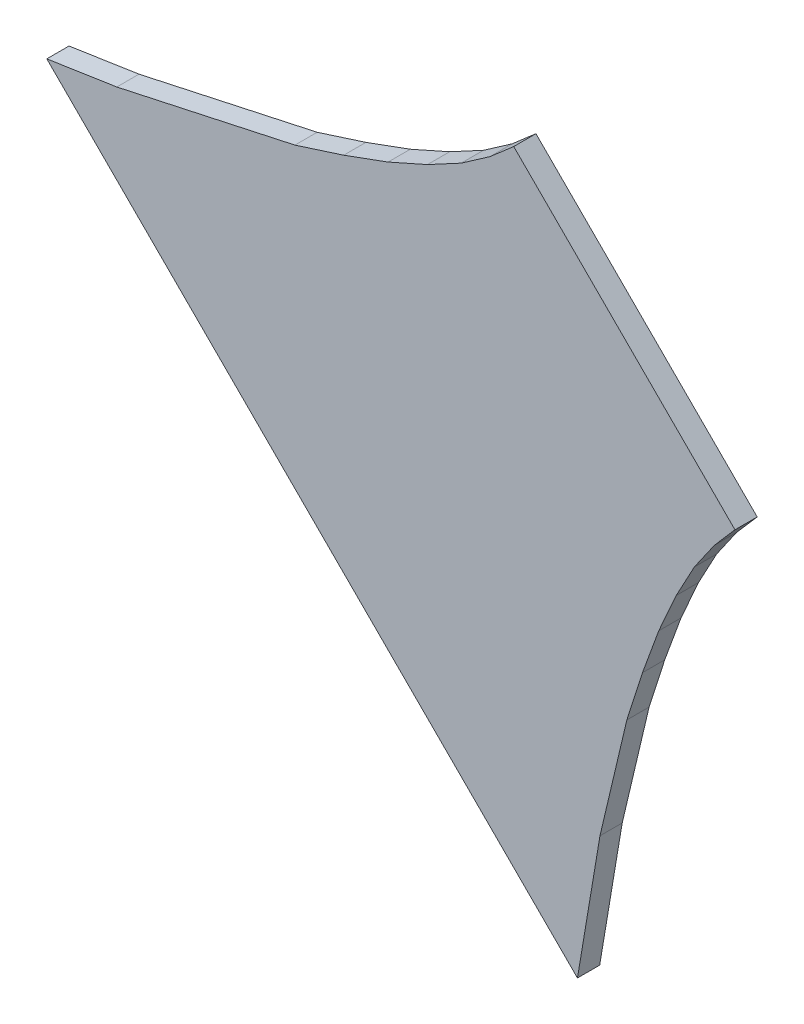
ISO-10303-21;
HEADER;
FILE_DESCRIPTION(('STEP AP214'),'2;1');
FILE_NAME('part.step','',(''),(''),'','','');
FILE_SCHEMA(('AUTOMOTIVE_DESIGN { 1 0 10303 214 1 1 1 1 }'));
ENDSEC;
DATA;
#1=APPLICATION_CONTEXT('core data for automotive mechanical design processes');
#2=APPLICATION_PROTOCOL_DEFINITION('international standard','automotive_design',2000,#1);
#3=PRODUCT_CONTEXT('',#1,'mechanical');
#4=PRODUCT('Part','Part','',(#3));
#5=PRODUCT_RELATED_PRODUCT_CATEGORY('part','',(#4));
#6=PRODUCT_DEFINITION_FORMATION('','',#4);
#7=PRODUCT_DEFINITION_CONTEXT('part definition',#1,'design');
#8=PRODUCT_DEFINITION('design','',#6,#7);
#9=PRODUCT_DEFINITION_SHAPE('','',#8);
#10=(LENGTH_UNIT() NAMED_UNIT(*) SI_UNIT(.MILLI.,.METRE.));
#11=(NAMED_UNIT(*) PLANE_ANGLE_UNIT() SI_UNIT($,.RADIAN.));
#12=(NAMED_UNIT(*) SI_UNIT($,.STERADIAN.) SOLID_ANGLE_UNIT());
#13=UNCERTAINTY_MEASURE_WITH_UNIT(LENGTH_MEASURE(1.E-05),#10,'distance_accuracy_value','');
#14=(GEOMETRIC_REPRESENTATION_CONTEXT(3) GLOBAL_UNCERTAINTY_ASSIGNED_CONTEXT((#13)) GLOBAL_UNIT_ASSIGNED_CONTEXT((#10,
#11,#12)) REPRESENTATION_CONTEXT('',''));
#15=CARTESIAN_POINT('',(0.,0.,0.));
#16=DIRECTION('',(0.,0.,1.));
#17=DIRECTION('',(1.,0.,0.));
#18=AXIS2_PLACEMENT_3D('',#15,#16,#17);
#19=CARTESIAN_POINT('',(48.7519989013672,97.7030029296875,0.));
#20=DIRECTION('',(0.655758286005358,-0.754970906946298,0.));
#21=DIRECTION('',(-0.754970906946298,-0.655758286005358,0.));
#22=AXIS2_PLACEMENT_3D('',#19,#20,#21);
#23=PLANE('',#22);
#24=DIRECTION('',(-0.754970906946298,-0.655758286005358,0.));
#25=VECTOR('',#24,1.);
#26=CARTESIAN_POINT('',(48.7519989013672,97.7030029296875,0.03556));
#27=LINE('',#26,#25);
#28=CARTESIAN_POINT('',(48.7519989013672,97.7030029296875,0.03556));
#29=VERTEX_POINT('',#28);
#30=CARTESIAN_POINT('',(48.7140007019043,97.6699981689453,0.03556));
#31=VERTEX_POINT('',#30);
#32=EDGE_CURVE('E11',#29,#31,#27,.T.);
#33=ORIENTED_EDGE('',*,*,#32,.F.);
#34=DIRECTION('',(0.,0.,1.));
#35=VECTOR('',#34,1.);
#36=CARTESIAN_POINT('',(48.7519989013672,97.7030029296875,0.));
#37=LINE('',#36,#35);
#38=CARTESIAN_POINT('',(48.7519989013672,97.7030029296875,0.));
#39=VERTEX_POINT('',#38);
#40=EDGE_CURVE('E24',#39,#29,#37,.T.);
#41=ORIENTED_EDGE('',*,*,#40,.F.);
#42=DIRECTION('',(-0.754970906946298,-0.655758286005358,0.));
#43=VECTOR('',#42,1.);
#44=CARTESIAN_POINT('',(48.7519989013672,97.7030029296875,0.));
#45=LINE('',#44,#43);
#46=CARTESIAN_POINT('',(48.7140007019043,97.6699981689453,0.));
#47=VERTEX_POINT('',#46);
#48=EDGE_CURVE('E160',#39,#47,#45,.T.);
#49=ORIENTED_EDGE('',*,*,#48,.T.);
#50=DIRECTION('',(0.,0.,1.));
#51=VECTOR('',#50,1.);
#52=CARTESIAN_POINT('',(48.7140007019043,97.6699981689453,0.));
#53=LINE('',#52,#51);
#54=EDGE_CURVE('E37',#47,#31,#53,.T.);
#55=ORIENTED_EDGE('',*,*,#54,.T.);
#56=EDGE_LOOP('',(#33,#41,#49,#55));
#57=FACE_BOUND('',#56,.T.);
#58=ADVANCED_FACE('F17',(#57),#23,.F.);
#59=CARTESIAN_POINT('',(48.7140007019043,97.6699981689453,0.));
#60=DIRECTION('',(0.571024595638433,-0.820932951693355,0.));
#61=DIRECTION('',(-0.820932951693355,-0.571024595638433,0.));
#62=AXIS2_PLACEMENT_3D('',#59,#60,#61);
#63=PLANE('',#62);
#64=DIRECTION('',(-0.820932951693355,-0.571024595638433,0.));
#65=VECTOR('',#64,1.);
#66=CARTESIAN_POINT('',(48.7140007019043,97.6699981689453,0.03556));
#67=LINE('',#66,#65);
#68=CARTESIAN_POINT('',(48.6679992675781,97.6380004882812,0.03556));
#69=VERTEX_POINT('',#68);
#70=EDGE_CURVE('E280',#31,#69,#67,.T.);
#71=ORIENTED_EDGE('',*,*,#70,.F.);
#72=ORIENTED_EDGE('',*,*,#54,.F.);
#73=DIRECTION('',(-0.820932951693355,-0.571024595638433,0.));
#74=VECTOR('',#73,1.);
#75=CARTESIAN_POINT('',(48.7140007019043,97.6699981689453,0.));
#76=LINE('',#75,#74);
#77=CARTESIAN_POINT('',(48.6679992675781,97.6380004882812,0.));
#78=VERTEX_POINT('',#77);
#79=EDGE_CURVE('E277',#47,#78,#76,.T.);
#80=ORIENTED_EDGE('',*,*,#79,.T.);
#81=DIRECTION('',(0.,0.,1.));
#82=VECTOR('',#81,1.);
#83=CARTESIAN_POINT('',(48.6679992675781,97.6380004882812,0.));
#84=LINE('',#83,#82);
#85=EDGE_CURVE('E275',#78,#69,#84,.T.);
#86=ORIENTED_EDGE('',*,*,#85,.T.);
#87=EDGE_LOOP('',(#71,#72,#80,#86));
#88=FACE_BOUND('',#87,.T.);
#89=ADVANCED_FACE('F288',(#88),#63,.F.);
#90=CARTESIAN_POINT('',(48.6679992675781,97.6380004882812,0.));
#91=DIRECTION('',(0.473112325610403,-0.881002115409217,0.));
#92=DIRECTION('',(-0.881002115409217,-0.473112325610403,0.));
#93=AXIS2_PLACEMENT_3D('',#90,#91,#92);
#94=PLANE('',#93);
#95=DIRECTION('',(-0.881002115409217,-0.473112325610403,0.));
#96=VECTOR('',#95,1.);
#97=CARTESIAN_POINT('',(48.6679992675781,97.6380004882812,0.03556));
#98=LINE('',#97,#96);
#99=CARTESIAN_POINT('',(48.6139984130859,97.609001159668,0.03556));
#100=VERTEX_POINT('',#99);
#101=EDGE_CURVE('E272',#69,#100,#98,.T.);
#102=ORIENTED_EDGE('',*,*,#101,.F.);
#103=ORIENTED_EDGE('',*,*,#85,.F.);
#104=DIRECTION('',(-0.881002115409217,-0.473112325610403,0.));
#105=VECTOR('',#104,1.);
#106=CARTESIAN_POINT('',(48.6679992675781,97.6380004882812,0.));
#107=LINE('',#106,#105);
#108=CARTESIAN_POINT('',(48.6139984130859,97.609001159668,0.));
#109=VERTEX_POINT('',#108);
#110=EDGE_CURVE('E269',#78,#109,#107,.T.);
#111=ORIENTED_EDGE('',*,*,#110,.T.);
#112=DIRECTION('',(0.,0.,1.));
#113=VECTOR('',#112,1.);
#114=CARTESIAN_POINT('',(48.6139984130859,97.609001159668,0.));
#115=LINE('',#114,#113);
#116=EDGE_CURVE('E267',#109,#100,#115,.T.);
#117=ORIENTED_EDGE('',*,*,#116,.T.);
#118=EDGE_LOOP('',(#102,#103,#111,#117));
#119=FACE_BOUND('',#118,.T.);
#120=ADVANCED_FACE('F294',(#119),#94,.F.);
#121=CARTESIAN_POINT('',(48.6139984130859,97.609001159668,0.));
#122=DIRECTION('',(0.406138466053448,-0.913811548620257,0.));
#123=DIRECTION('',(-0.913811548620257,-0.406138466053448,0.));
#124=AXIS2_PLACEMENT_3D('',#121,#122,#123);
#125=PLANE('',#124);
#126=DIRECTION('',(-0.913811548620257,-0.406138466053448,0.));
#127=VECTOR('',#126,1.);
#128=CARTESIAN_POINT('',(48.6139984130859,97.609001159668,0.03556));
#129=LINE('',#128,#127);
#130=CARTESIAN_POINT('',(48.5509986877441,97.5810012817383,0.03556));
#131=VERTEX_POINT('',#130);
#132=EDGE_CURVE('E264',#100,#131,#129,.T.);
#133=ORIENTED_EDGE('',*,*,#132,.F.);
#134=ORIENTED_EDGE('',*,*,#116,.F.);
#135=DIRECTION('',(-0.913811548620257,-0.406138466053448,0.));
#136=VECTOR('',#135,1.);
#137=CARTESIAN_POINT('',(48.6139984130859,97.609001159668,0.));
#138=LINE('',#137,#136);
#139=CARTESIAN_POINT('',(48.5509986877441,97.5810012817383,0.));
#140=VERTEX_POINT('',#139);
#141=EDGE_CURVE('E261',#109,#140,#138,.T.);
#142=ORIENTED_EDGE('',*,*,#141,.T.);
#143=DIRECTION('',(0.,0.,1.));
#144=VECTOR('',#143,1.);
#145=CARTESIAN_POINT('',(48.5509986877441,97.5810012817383,0.));
#146=LINE('',#145,#144);
#147=EDGE_CURVE('E259',#140,#131,#146,.T.);
#148=ORIENTED_EDGE('',*,*,#147,.T.);
#149=EDGE_LOOP('',(#133,#134,#142,#148));
#150=FACE_BOUND('',#149,.T.);
#151=ADVANCED_FACE('F296',(#150),#125,.F.);
#152=CARTESIAN_POINT('',(48.5509986877441,97.5810012817383,0.));
#153=DIRECTION('',(0.343881049565291,-0.939013218091138,0.));
#154=DIRECTION('',(-0.939013218091138,-0.343881049565291,0.));
#155=AXIS2_PLACEMENT_3D('',#152,#153,#154);
#156=PLANE('',#155);
#157=DIRECTION('',(-0.939013218091137,-0.343881049565291,0.));
#158=VECTOR('',#157,1.);
#159=CARTESIAN_POINT('',(48.5509986877441,97.5810012817383,0.03556));
#160=LINE('',#159,#158);
#161=CARTESIAN_POINT('',(48.4799995422363,97.5550003051758,0.03556));
#162=VERTEX_POINT('',#161);
#163=EDGE_CURVE('E256',#131,#162,#160,.T.);
#164=ORIENTED_EDGE('',*,*,#163,.F.);
#165=ORIENTED_EDGE('',*,*,#147,.F.);
#166=DIRECTION('',(-0.939013218091137,-0.343881049565291,0.));
#167=VECTOR('',#166,1.);
#168=CARTESIAN_POINT('',(48.5509986877441,97.5810012817383,0.));
#169=LINE('',#168,#167);
#170=CARTESIAN_POINT('',(48.4799995422363,97.5550003051758,0.));
#171=VERTEX_POINT('',#170);
#172=EDGE_CURVE('E253',#140,#171,#169,.T.);
#173=ORIENTED_EDGE('',*,*,#172,.T.);
#174=DIRECTION('',(0.,0.,1.));
#175=VECTOR('',#174,1.);
#176=CARTESIAN_POINT('',(48.4799995422363,97.5550003051758,0.));
#177=LINE('',#176,#175);
#178=EDGE_CURVE('E251',#171,#162,#177,.T.);
#179=ORIENTED_EDGE('',*,*,#178,.T.);
#180=EDGE_LOOP('',(#164,#165,#173,#179));
#181=FACE_BOUND('',#180,.T.);
#182=ADVANCED_FACE('F301',(#181),#156,.F.);
#183=CARTESIAN_POINT('',(48.4799995422363,97.5550003051758,0.));
#184=DIRECTION('',(0.305238716183896,-0.952275866617656,0.));
#185=DIRECTION('',(-0.952275866617656,-0.305238716183896,0.));
#186=AXIS2_PLACEMENT_3D('',#183,#184,#185);
#187=PLANE('',#186);
#188=DIRECTION('',(-0.952275866617656,-0.305238716183896,0.));
#189=VECTOR('',#188,1.);
#190=CARTESIAN_POINT('',(48.4799995422363,97.5550003051758,0.03556));
#191=LINE('',#190,#189);
#192=CARTESIAN_POINT('',(48.4020004272461,97.5299987792969,0.03556));
#193=VERTEX_POINT('',#192);
#194=EDGE_CURVE('E248',#162,#193,#191,.T.);
#195=ORIENTED_EDGE('',*,*,#194,.F.);
#196=ORIENTED_EDGE('',*,*,#178,.F.);
#197=DIRECTION('',(-0.952275866617656,-0.305238716183896,0.));
#198=VECTOR('',#197,1.);
#199=CARTESIAN_POINT('',(48.4799995422363,97.5550003051758,0.));
#200=LINE('',#199,#198);
#201=CARTESIAN_POINT('',(48.4020004272461,97.5299987792969,0.));
#202=VERTEX_POINT('',#201);
#203=EDGE_CURVE('E245',#171,#202,#200,.T.);
#204=ORIENTED_EDGE('',*,*,#203,.T.);
#205=DIRECTION('',(0.,0.,1.));
#206=VECTOR('',#205,1.);
#207=CARTESIAN_POINT('',(48.4020004272461,97.5299987792969,0.));
#208=LINE('',#207,#206);
#209=EDGE_CURVE('E243',#202,#193,#208,.T.);
#210=ORIENTED_EDGE('',*,*,#209,.T.);
#211=EDGE_LOOP('',(#195,#196,#204,#210));
#212=FACE_BOUND('',#211,.T.);
#213=ADVANCED_FACE('F304',(#212),#187,.F.);
#214=CARTESIAN_POINT('',(48.4020004272461,97.5299987792969,0.));
#215=DIRECTION('',(0.21256050361779,-0.977147907075357,0.));
#216=DIRECTION('',(-0.977147907075357,-0.21256050361779,0.));
#217=AXIS2_PLACEMENT_3D('',#214,#215,#216);
#218=PLANE('',#217);
#219=DIRECTION('',(-0.977147907075357,-0.21256050361779,0.));
#220=VECTOR('',#219,1.);
#221=CARTESIAN_POINT('',(48.4020004272461,97.5299987792969,0.03556));
#222=LINE('',#221,#220);
#223=CARTESIAN_POINT('',(48.117000579834,97.4680023193359,0.03556));
#224=VERTEX_POINT('',#223);
#225=EDGE_CURVE('E240',#193,#224,#222,.T.);
#226=ORIENTED_EDGE('',*,*,#225,.F.);
#227=ORIENTED_EDGE('',*,*,#209,.F.);
#228=DIRECTION('',(-0.977147907075357,-0.21256050361779,0.));
#229=VECTOR('',#228,1.);
#230=CARTESIAN_POINT('',(48.4020004272461,97.5299987792969,0.));
#231=LINE('',#230,#229);
#232=CARTESIAN_POINT('',(48.117000579834,97.4680023193359,0.));
#233=VERTEX_POINT('',#232);
#234=EDGE_CURVE('E237',#202,#233,#231,.T.);
#235=ORIENTED_EDGE('',*,*,#234,.T.);
#236=DIRECTION('',(0.,0.,1.));
#237=VECTOR('',#236,1.);
#238=CARTESIAN_POINT('',(48.117000579834,97.4680023193359,0.));
#239=LINE('',#238,#237);
#240=EDGE_CURVE('E235',#233,#224,#239,.T.);
#241=ORIENTED_EDGE('',*,*,#240,.T.);
#242=EDGE_LOOP('',(#226,#227,#235,#241));
#243=FACE_BOUND('',#242,.T.);
#244=ADVANCED_FACE('F309',(#243),#218,.F.);
#245=CARTESIAN_POINT('',(48.117000579834,97.4680023193359,0.));
#246=DIRECTION('',(0.150118594317319,-0.988667996670365,0.));
#247=DIRECTION('',(-0.988667996670365,-0.150118594317319,0.));
#248=AXIS2_PLACEMENT_3D('',#245,#246,#247);
#249=PLANE('',#248);
#250=DIRECTION('',(-0.988667996670365,-0.150118594317319,0.));
#251=VECTOR('',#250,1.);
#252=CARTESIAN_POINT('',(48.117000579834,97.4680023193359,0.03556));
#253=LINE('',#252,#251);
#254=CARTESIAN_POINT('',(48.0050010681152,97.4509963989258,0.03556));
#255=VERTEX_POINT('',#254);
#256=EDGE_CURVE('E232',#224,#255,#253,.T.);
#257=ORIENTED_EDGE('',*,*,#256,.F.);
#258=ORIENTED_EDGE('',*,*,#240,.F.);
#259=DIRECTION('',(-0.988667996670365,-0.150118594317319,0.));
#260=VECTOR('',#259,1.);
#261=CARTESIAN_POINT('',(48.117000579834,97.4680023193359,0.));
#262=LINE('',#261,#260);
#263=CARTESIAN_POINT('',(48.0050010681152,97.4509963989258,0.));
#264=VERTEX_POINT('',#263);
#265=EDGE_CURVE('E229',#233,#264,#262,.T.);
#266=ORIENTED_EDGE('',*,*,#265,.T.);
#267=DIRECTION('',(0.,0.,1.));
#268=VECTOR('',#267,1.);
#269=CARTESIAN_POINT('',(48.0050010681152,97.4509963989258,0.));
#270=LINE('',#269,#268);
#271=EDGE_CURVE('E227',#264,#255,#270,.T.);
#272=ORIENTED_EDGE('',*,*,#271,.T.);
#273=EDGE_LOOP('',(#257,#258,#266,#272));
#274=FACE_BOUND('',#273,.T.);
#275=ADVANCED_FACE('F312',(#274),#249,.F.);
#276=CARTESIAN_POINT('',(48.0050010681152,97.4509963989258,0.));
#277=DIRECTION('',(0.707106781186548,0.707106781186548,0.));
#278=DIRECTION('',(0.707106781186548,-0.707106781186548,0.));
#279=AXIS2_PLACEMENT_3D('',#276,#277,#278);
#280=PLANE('',#279);
#281=DIRECTION('',(0.707106781186548,-0.707106781186548,0.));
#282=VECTOR('',#281,1.);
#283=CARTESIAN_POINT('',(48.0050010681152,97.4509963989258,0.03556));
#284=LINE('',#283,#282);
#285=CARTESIAN_POINT('',(48.8540000915527,96.6019973754883,0.03556));
#286=VERTEX_POINT('',#285);
#287=EDGE_CURVE('E224',#255,#286,#284,.T.);
#288=ORIENTED_EDGE('',*,*,#287,.F.);
#289=ORIENTED_EDGE('',*,*,#271,.F.);
#290=DIRECTION('',(0.707106781186548,-0.707106781186548,0.));
#291=VECTOR('',#290,1.);
#292=CARTESIAN_POINT('',(48.0050010681152,97.4509963989258,0.));
#293=LINE('',#292,#291);
#294=CARTESIAN_POINT('',(48.8540000915527,96.6019973754883,0.));
#295=VERTEX_POINT('',#294);
#296=EDGE_CURVE('E221',#264,#295,#293,.T.);
#297=ORIENTED_EDGE('',*,*,#296,.T.);
#298=DIRECTION('',(0.,0.,1.));
#299=VECTOR('',#298,1.);
#300=CARTESIAN_POINT('',(48.8540000915527,96.6019973754883,0.));
#301=LINE('',#300,#299);
#302=EDGE_CURVE('E219',#295,#286,#301,.T.);
#303=ORIENTED_EDGE('',*,*,#302,.T.);
#304=EDGE_LOOP('',(#288,#289,#297,#303));
#305=FACE_BOUND('',#304,.T.);
#306=ADVANCED_FACE('F317',(#305),#280,.F.);
#307=CARTESIAN_POINT('',(48.8540000915527,96.6019973754883,0.));
#308=DIRECTION('',(-0.986270682956926,0.165136731043336,0.));
#309=DIRECTION('',(0.165136731043336,0.986270682956926,0.));
#310=AXIS2_PLACEMENT_3D('',#307,#308,#309);
#311=PLANE('',#310);
#312=DIRECTION('',(0.165136731043336,0.986270682956926,0.));
#313=VECTOR('',#312,1.);
#314=CARTESIAN_POINT('',(48.8540000915527,96.6019973754883,0.03556));
#315=LINE('',#314,#313);
#316=CARTESIAN_POINT('',(48.8899993896484,96.8170013427734,0.03556));
#317=VERTEX_POINT('',#316);
#318=EDGE_CURVE('E216',#286,#317,#315,.T.);
#319=ORIENTED_EDGE('',*,*,#318,.F.);
#320=ORIENTED_EDGE('',*,*,#302,.F.);
#321=DIRECTION('',(0.165136731043336,0.986270682956926,0.));
#322=VECTOR('',#321,1.);
#323=CARTESIAN_POINT('',(48.8540000915527,96.6019973754883,0.));
#324=LINE('',#323,#322);
#325=CARTESIAN_POINT('',(48.8899993896484,96.8170013427734,0.));
#326=VERTEX_POINT('',#325);
#327=EDGE_CURVE('E213',#295,#326,#324,.T.);
#328=ORIENTED_EDGE('',*,*,#327,.T.);
#329=DIRECTION('',(0.,0.,1.));
#330=VECTOR('',#329,1.);
#331=CARTESIAN_POINT('',(48.8899993896484,96.8170013427734,0.));
#332=LINE('',#331,#330);
#333=EDGE_CURVE('E211',#326,#317,#332,.T.);
#334=ORIENTED_EDGE('',*,*,#333,.T.);
#335=EDGE_LOOP('',(#319,#320,#328,#334));
#336=FACE_BOUND('',#335,.T.);
#337=ADVANCED_FACE('F320',(#336),#311,.F.);
#338=CARTESIAN_POINT('',(48.8899993896484,96.8170013427734,0.));
#339=DIRECTION('',(-0.973207024666526,0.229930613750599,0.));
#340=DIRECTION('',(0.229930613750599,0.973207024666526,0.));
#341=AXIS2_PLACEMENT_3D('',#338,#339,#340);
#342=PLANE('',#341);
#343=DIRECTION('',(0.229930613750599,0.973207024666526,0.));
#344=VECTOR('',#343,1.);
#345=CARTESIAN_POINT('',(48.8899993896484,96.8170013427734,0.03556));
#346=LINE('',#345,#344);
#347=CARTESIAN_POINT('',(48.9329986572266,96.9990005493164,0.03556));
#348=VERTEX_POINT('',#347);
#349=EDGE_CURVE('E208',#317,#348,#346,.T.);
#350=ORIENTED_EDGE('',*,*,#349,.F.);
#351=ORIENTED_EDGE('',*,*,#333,.F.);
#352=DIRECTION('',(0.229930613750599,0.973207024666526,0.));
#353=VECTOR('',#352,1.);
#354=CARTESIAN_POINT('',(48.8899993896484,96.8170013427734,0.));
#355=LINE('',#354,#353);
#356=CARTESIAN_POINT('',(48.9329986572266,96.9990005493164,0.));
#357=VERTEX_POINT('',#356);
#358=EDGE_CURVE('E205',#326,#357,#355,.T.);
#359=ORIENTED_EDGE('',*,*,#358,.T.);
#360=DIRECTION('',(0.,0.,1.));
#361=VECTOR('',#360,1.);
#362=CARTESIAN_POINT('',(48.9329986572266,96.9990005493164,0.));
#363=LINE('',#362,#361);
#364=EDGE_CURVE('E203',#357,#348,#363,.T.);
#365=ORIENTED_EDGE('',*,*,#364,.T.);
#366=EDGE_LOOP('',(#350,#351,#359,#365));
#367=FACE_BOUND('',#366,.T.);
#368=ADVANCED_FACE('F325',(#367),#342,.F.);
#369=CARTESIAN_POINT('',(48.9329986572266,96.9990005493164,0.));
#370=DIRECTION('',(-0.952280205556479,0.305225179343562,0.));
#371=DIRECTION('',(0.305225179343562,0.952280205556479,0.));
#372=AXIS2_PLACEMENT_3D('',#369,#370,#371);
#373=PLANE('',#372);
#374=DIRECTION('',(0.305225179343562,0.952280205556479,0.));
#375=VECTOR('',#374,1.);
#376=CARTESIAN_POINT('',(48.9329986572266,96.9990005493164,0.03556));
#377=LINE('',#376,#375);
#378=CARTESIAN_POINT('',(48.9580001831055,97.0770034790039,0.03556));
#379=VERTEX_POINT('',#378);
#380=EDGE_CURVE('E200',#348,#379,#377,.T.);
#381=ORIENTED_EDGE('',*,*,#380,.F.);
#382=ORIENTED_EDGE('',*,*,#364,.F.);
#383=DIRECTION('',(0.305225179343562,0.952280205556479,0.));
#384=VECTOR('',#383,1.);
#385=CARTESIAN_POINT('',(48.9329986572266,96.9990005493164,0.));
#386=LINE('',#385,#384);
#387=CARTESIAN_POINT('',(48.9580001831055,97.0770034790039,0.));
#388=VERTEX_POINT('',#387);
#389=EDGE_CURVE('E197',#357,#388,#386,.T.);
#390=ORIENTED_EDGE('',*,*,#389,.T.);
#391=DIRECTION('',(0.,0.,1.));
#392=VECTOR('',#391,1.);
#393=CARTESIAN_POINT('',(48.9580001831055,97.0770034790039,0.));
#394=LINE('',#393,#392);
#395=EDGE_CURVE('E195',#388,#379,#394,.T.);
#396=ORIENTED_EDGE('',*,*,#395,.T.);
#397=EDGE_LOOP('',(#381,#382,#390,#396));
#398=FACE_BOUND('',#397,.T.);
#399=ADVANCED_FACE('F328',(#398),#373,.F.);
#400=CARTESIAN_POINT('',(48.9580001831055,97.0770034790039,0.));
#401=DIRECTION('',(-0.939013218091138,0.343881049565291,0.));
#402=DIRECTION('',(0.343881049565291,0.939013218091138,0.));
#403=AXIS2_PLACEMENT_3D('',#400,#401,#402);
#404=PLANE('',#403);
#405=DIRECTION('',(0.343881049565291,0.939013218091137,0.));
#406=VECTOR('',#405,1.);
#407=CARTESIAN_POINT('',(48.9580001831055,97.0770034790039,0.03556));
#408=LINE('',#407,#406);
#409=CARTESIAN_POINT('',(48.984001159668,97.1480026245117,0.03556));
#410=VERTEX_POINT('',#409);
#411=EDGE_CURVE('E192',#379,#410,#408,.T.);
#412=ORIENTED_EDGE('',*,*,#411,.F.);
#413=ORIENTED_EDGE('',*,*,#395,.F.);
#414=DIRECTION('',(0.343881049565291,0.939013218091137,0.));
#415=VECTOR('',#414,1.);
#416=CARTESIAN_POINT('',(48.9580001831055,97.0770034790039,0.));
#417=LINE('',#416,#415);
#418=CARTESIAN_POINT('',(48.984001159668,97.1480026245117,0.));
#419=VERTEX_POINT('',#418);
#420=EDGE_CURVE('E189',#388,#419,#417,.T.);
#421=ORIENTED_EDGE('',*,*,#420,.T.);
#422=DIRECTION('',(0.,0.,1.));
#423=VECTOR('',#422,1.);
#424=CARTESIAN_POINT('',(48.984001159668,97.1480026245117,0.));
#425=LINE('',#424,#423);
#426=EDGE_CURVE('E187',#419,#410,#425,.T.);
#427=ORIENTED_EDGE('',*,*,#426,.T.);
#428=EDGE_LOOP('',(#412,#413,#421,#427));
#429=FACE_BOUND('',#428,.T.);
#430=ADVANCED_FACE('F333',(#429),#404,.F.);
#431=CARTESIAN_POINT('',(48.984001159668,97.1480026245117,0.));
#432=DIRECTION('',(-0.913802420964502,0.406159002657106,0.));
#433=DIRECTION('',(0.406159002657106,0.913802420964502,0.));
#434=AXIS2_PLACEMENT_3D('',#431,#432,#433);
#435=PLANE('',#434);
#436=DIRECTION('',(0.406159002657106,0.913802420964502,0.));
#437=VECTOR('',#436,1.);
#438=CARTESIAN_POINT('',(48.984001159668,97.1480026245117,0.03556));
#439=LINE('',#438,#437);
#440=CARTESIAN_POINT('',(49.0120010375976,97.2109985351563,0.03556));
#441=VERTEX_POINT('',#440);
#442=EDGE_CURVE('E184',#410,#441,#439,.T.);
#443=ORIENTED_EDGE('',*,*,#442,.F.);
#444=ORIENTED_EDGE('',*,*,#426,.F.);
#445=DIRECTION('',(0.406159002657106,0.913802420964502,0.));
#446=VECTOR('',#445,1.);
#447=CARTESIAN_POINT('',(48.984001159668,97.1480026245117,0.));
#448=LINE('',#447,#446);
#449=CARTESIAN_POINT('',(49.0120010375976,97.2109985351563,0.));
#450=VERTEX_POINT('',#449);
#451=EDGE_CURVE('E181',#419,#450,#448,.T.);
#452=ORIENTED_EDGE('',*,*,#451,.T.);
#453=DIRECTION('',(0.,0.,1.));
#454=VECTOR('',#453,1.);
#455=CARTESIAN_POINT('',(49.0120010375976,97.2109985351563,0.));
#456=LINE('',#455,#454);
#457=EDGE_CURVE('E179',#450,#441,#456,.T.);
#458=ORIENTED_EDGE('',*,*,#457,.T.);
#459=EDGE_LOOP('',(#443,#444,#452,#458));
#460=FACE_BOUND('',#459,.T.);
#461=ADVANCED_FACE('F336',(#460),#435,.F.);
#462=CARTESIAN_POINT('',(49.0120010375977,97.2109985351563,0.));
#463=DIRECTION('',(-0.881002115409217,0.473112325610403,0.));
#464=DIRECTION('',(0.473112325610403,0.881002115409217,0.));
#465=AXIS2_PLACEMENT_3D('',#462,#463,#464);
#466=PLANE('',#465);
#467=DIRECTION('',(0.473112325610403,0.881002115409217,0.));
#468=VECTOR('',#467,1.);
#469=CARTESIAN_POINT('',(49.0120010375976,97.2109985351563,0.03556));
#470=LINE('',#469,#468);
#471=CARTESIAN_POINT('',(49.0410003662109,97.2649993896484,0.03556));
#472=VERTEX_POINT('',#471);
#473=EDGE_CURVE('E176',#441,#472,#470,.T.);
#474=ORIENTED_EDGE('',*,*,#473,.F.);
#475=ORIENTED_EDGE('',*,*,#457,.F.);
#476=DIRECTION('',(0.473112325610403,0.881002115409217,0.));
#477=VECTOR('',#476,1.);
#478=CARTESIAN_POINT('',(49.0120010375976,97.2109985351563,0.));
#479=LINE('',#478,#477);
#480=CARTESIAN_POINT('',(49.0410003662109,97.2649993896484,0.));
#481=VERTEX_POINT('',#480);
#482=EDGE_CURVE('E173',#450,#481,#479,.T.);
#483=ORIENTED_EDGE('',*,*,#482,.T.);
#484=DIRECTION('',(0.,0.,1.));
#485=VECTOR('',#484,1.);
#486=CARTESIAN_POINT('',(49.0410003662109,97.2649993896484,0.));
#487=LINE('',#486,#485);
#488=EDGE_CURVE('E171',#481,#472,#487,.T.);
#489=ORIENTED_EDGE('',*,*,#488,.T.);
#490=EDGE_LOOP('',(#474,#475,#483,#489));
#491=FACE_BOUND('',#490,.T.);
#492=ADVANCED_FACE('F341',(#491),#466,.F.);
#493=CARTESIAN_POINT('',(49.0410003662109,97.2649993896484,0.));
#494=DIRECTION('',(-0.820878837129,0.571102385526222,0.));
#495=DIRECTION('',(0.571102385526222,0.820878837129,0.));
#496=AXIS2_PLACEMENT_3D('',#493,#494,#495);
#497=PLANE('',#496);
#498=DIRECTION('',(0.571102385526222,0.820878837129,0.));
#499=VECTOR('',#498,1.);
#500=CARTESIAN_POINT('',(49.0410003662109,97.2649993896484,0.03556));
#501=LINE('',#500,#499);
#502=CARTESIAN_POINT('',(49.0730018615723,97.3109970092773,0.03556));
#503=VERTEX_POINT('',#502);
#504=EDGE_CURVE('E168',#472,#503,#501,.T.);
#505=ORIENTED_EDGE('',*,*,#504,.F.);
#506=ORIENTED_EDGE('',*,*,#488,.F.);
#507=DIRECTION('',(0.571102385526222,0.820878837129,0.));
#508=VECTOR('',#507,1.);
#509=CARTESIAN_POINT('',(49.0410003662109,97.2649993896484,0.));
#510=LINE('',#509,#508);
#511=CARTESIAN_POINT('',(49.0730018615723,97.3109970092773,0.));
#512=VERTEX_POINT('',#511);
#513=EDGE_CURVE('E166',#481,#512,#510,.T.);
#514=ORIENTED_EDGE('',*,*,#513,.T.);
#515=DIRECTION('',(0.,0.,1.));
#516=VECTOR('',#515,1.);
#517=CARTESIAN_POINT('',(49.0730018615723,97.3109970092773,0.));
#518=LINE('',#517,#516);
#519=EDGE_CURVE('E151',#512,#503,#518,.T.);
#520=ORIENTED_EDGE('',*,*,#519,.T.);
#521=EDGE_LOOP('',(#505,#506,#514,#520));
#522=FACE_BOUND('',#521,.T.);
#523=ADVANCED_FACE('F343',(#522),#497,.F.);
#524=CARTESIAN_POINT('',(49.0730018615723,97.3109970092773,0.));
#525=DIRECTION('',(-0.755078540245818,0.655634347834404,0.));
#526=DIRECTION('',(0.655634347834404,0.755078540245818,0.));
#527=AXIS2_PLACEMENT_3D('',#524,#525,#526);
#528=PLANE('',#527);
#529=DIRECTION('',(0.655634347834404,0.755078540245818,0.));
#530=VECTOR('',#529,1.);
#531=CARTESIAN_POINT('',(49.0730018615723,97.3109970092773,0.03556));
#532=LINE('',#531,#530);
#533=CARTESIAN_POINT('',(49.1059989929199,97.3489990234375,0.03556));
#534=VERTEX_POINT('',#533);
#535=EDGE_CURVE('E155',#503,#534,#532,.T.);
#536=ORIENTED_EDGE('',*,*,#535,.F.);
#537=ORIENTED_EDGE('',*,*,#519,.F.);
#538=DIRECTION('',(0.655634347834404,0.755078540245818,0.));
#539=VECTOR('',#538,1.);
#540=CARTESIAN_POINT('',(49.0730018615723,97.3109970092773,0.));
#541=LINE('',#540,#539);
#542=CARTESIAN_POINT('',(49.1059989929199,97.3489990234375,0.));
#543=VERTEX_POINT('',#542);
#544=EDGE_CURVE('E147',#512,#543,#541,.T.);
#545=ORIENTED_EDGE('',*,*,#544,.T.);
#546=DIRECTION('',(0.,0.,1.));
#547=VECTOR('',#546,1.);
#548=CARTESIAN_POINT('',(49.1059989929199,97.3489990234375,0.));
#549=LINE('',#548,#547);
#550=EDGE_CURVE('E137',#543,#534,#549,.T.);
#551=ORIENTED_EDGE('',*,*,#550,.T.);
#552=EDGE_LOOP('',(#536,#537,#545,#551));
#553=FACE_BOUND('',#552,.T.);
#554=ADVANCED_FACE('F150',(#553),#528,.F.);
#555=CARTESIAN_POINT('',(49.1059989929199,97.3489990234375,0.));
#556=DIRECTION('',(-0.707110591039382,-0.707102971313186,0.));
#557=DIRECTION('',(-0.707102971313186,0.707110591039382,0.));
#558=AXIS2_PLACEMENT_3D('',#555,#556,#557);
#559=PLANE('',#558);
#560=DIRECTION('',(-0.707102971313186,0.707110591039382,0.));
#561=VECTOR('',#560,1.);
#562=CARTESIAN_POINT('',(49.1059989929199,97.3489990234375,0.03556));
#563=LINE('',#562,#561);
#564=EDGE_CURVE('E143',#534,#29,#563,.T.);
#565=ORIENTED_EDGE('',*,*,#564,.F.);
#566=ORIENTED_EDGE('',*,*,#550,.F.);
#567=DIRECTION('',(-0.707102971313186,0.707110591039382,0.));
#568=VECTOR('',#567,1.);
#569=CARTESIAN_POINT('',(49.1059989929199,97.3489990234375,0.));
#570=LINE('',#569,#568);
#571=EDGE_CURVE('E141',#543,#39,#570,.T.);
#572=ORIENTED_EDGE('',*,*,#571,.T.);
#573=ORIENTED_EDGE('',*,*,#40,.T.);
#574=EDGE_LOOP('',(#565,#566,#572,#573));
#575=FACE_BOUND('',#574,.T.);
#576=ADVANCED_FACE('F139',(#575),#559,.F.);
#577=CARTESIAN_POINT('',(48.7519989013672,97.7030029296875,0.));
#578=DIRECTION('',(0.,0.,1.));
#579=DIRECTION('',(1.,0.,0.));
#580=AXIS2_PLACEMENT_3D('',#577,#578,#579);
#581=PLANE('',#580);
#582=ORIENTED_EDGE('',*,*,#571,.F.);
#583=ORIENTED_EDGE('',*,*,#544,.F.);
#584=ORIENTED_EDGE('',*,*,#513,.F.);
#585=ORIENTED_EDGE('',*,*,#482,.F.);
#586=ORIENTED_EDGE('',*,*,#451,.F.);
#587=ORIENTED_EDGE('',*,*,#420,.F.);
#588=ORIENTED_EDGE('',*,*,#389,.F.);
#589=ORIENTED_EDGE('',*,*,#358,.F.);
#590=ORIENTED_EDGE('',*,*,#327,.F.);
#591=ORIENTED_EDGE('',*,*,#296,.F.);
#592=ORIENTED_EDGE('',*,*,#265,.F.);
#593=ORIENTED_EDGE('',*,*,#234,.F.);
#594=ORIENTED_EDGE('',*,*,#203,.F.);
#595=ORIENTED_EDGE('',*,*,#172,.F.);
#596=ORIENTED_EDGE('',*,*,#141,.F.);
#597=ORIENTED_EDGE('',*,*,#110,.F.);
#598=ORIENTED_EDGE('',*,*,#79,.F.);
#599=ORIENTED_EDGE('',*,*,#48,.F.);
#600=EDGE_LOOP('',(#582,#583,#584,#585,#586,#587,#588,#589,#590,#591,#592,#593,#594,#595,#596,
#597,#598,#599));
#601=FACE_BOUND('',#600,.T.);
#602=ADVANCED_FACE('F158',(#601),#581,.F.);
#603=CARTESIAN_POINT('',(48.7519989013672,97.7030029296875,0.03556));
#604=DIRECTION('',(0.,0.,1.));
#605=DIRECTION('',(1.,0.,0.));
#606=AXIS2_PLACEMENT_3D('',#603,#604,#605);
#607=PLANE('',#606);
#608=ORIENTED_EDGE('',*,*,#32,.T.);
#609=ORIENTED_EDGE('',*,*,#70,.T.);
#610=ORIENTED_EDGE('',*,*,#101,.T.);
#611=ORIENTED_EDGE('',*,*,#132,.T.);
#612=ORIENTED_EDGE('',*,*,#163,.T.);
#613=ORIENTED_EDGE('',*,*,#194,.T.);
#614=ORIENTED_EDGE('',*,*,#225,.T.);
#615=ORIENTED_EDGE('',*,*,#256,.T.);
#616=ORIENTED_EDGE('',*,*,#287,.T.);
#617=ORIENTED_EDGE('',*,*,#318,.T.);
#618=ORIENTED_EDGE('',*,*,#349,.T.);
#619=ORIENTED_EDGE('',*,*,#380,.T.);
#620=ORIENTED_EDGE('',*,*,#411,.T.);
#621=ORIENTED_EDGE('',*,*,#442,.T.);
#622=ORIENTED_EDGE('',*,*,#473,.T.);
#623=ORIENTED_EDGE('',*,*,#504,.T.);
#624=ORIENTED_EDGE('',*,*,#535,.T.);
#625=ORIENTED_EDGE('',*,*,#564,.T.);
#626=EDGE_LOOP('',(#608,#609,#610,#611,#612,#613,#614,#615,#616,#617,#618,#619,#620,#621,#622,
#623,#624,#625));
#627=FACE_BOUND('',#626,.T.);
#628=ADVANCED_FACE('F291',(#627),#607,.T.);
#629=CLOSED_SHELL('',(#58,#89,#120,#151,#182,#213,#244,#275,#306,#337,#368,#399,#430,#461,#492,
#523,#554,#576,#602,#628));
#630=MANIFOLD_SOLID_BREP('B1',#629);
#631=ADVANCED_BREP_SHAPE_REPRESENTATION('',(#18,#630),#14);
#632=SHAPE_DEFINITION_REPRESENTATION(#9,#631);
ENDSEC;
END-ISO-10303-21;
